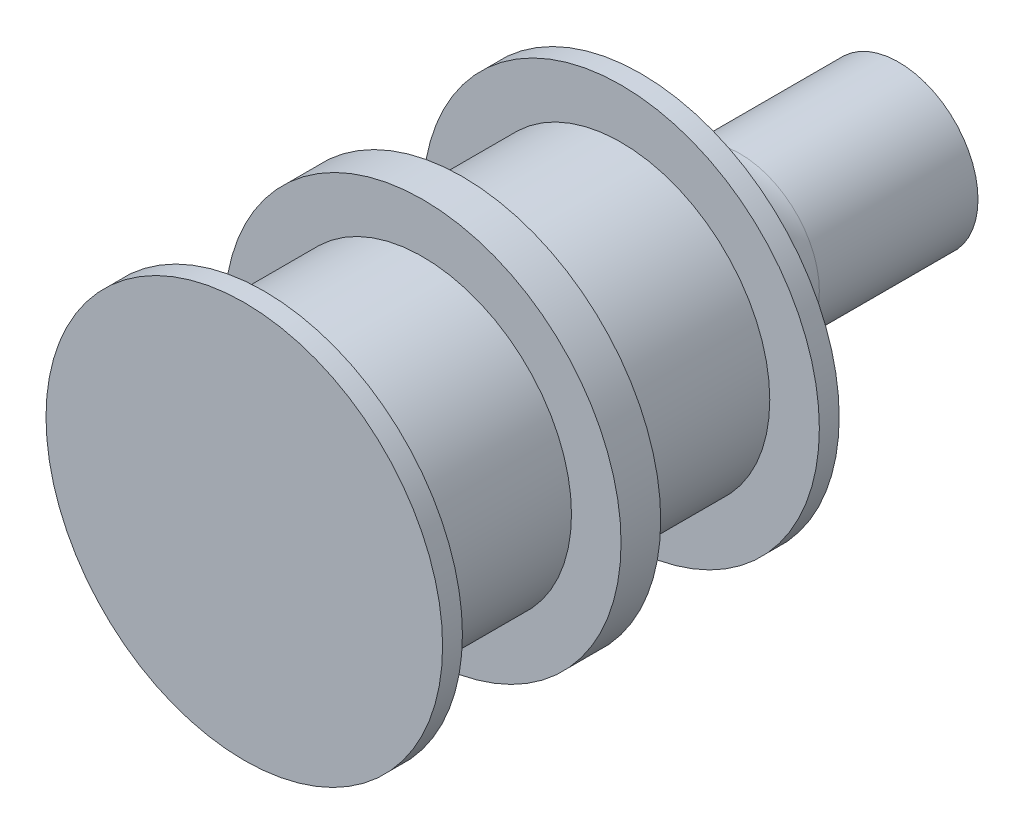
ISO-10303-21;
HEADER;
FILE_DESCRIPTION(('STEP AP214'),'2;1');
FILE_NAME('part.step','',(''),(''),'','','');
FILE_SCHEMA(('AUTOMOTIVE_DESIGN { 1 0 10303 214 1 1 1 1 }'));
ENDSEC;
DATA;
#1=APPLICATION_CONTEXT('core data for automotive mechanical design processes');
#2=APPLICATION_PROTOCOL_DEFINITION('international standard','automotive_design',2000,#1);
#3=PRODUCT_CONTEXT('',#1,'mechanical');
#4=PRODUCT('Part','Part','',(#3));
#5=PRODUCT_RELATED_PRODUCT_CATEGORY('part','',(#4));
#6=PRODUCT_DEFINITION_FORMATION('','',#4);
#7=PRODUCT_DEFINITION_CONTEXT('part definition',#1,'design');
#8=PRODUCT_DEFINITION('design','',#6,#7);
#9=PRODUCT_DEFINITION_SHAPE('','',#8);
#10=(LENGTH_UNIT() NAMED_UNIT(*) SI_UNIT(.MILLI.,.METRE.));
#11=(NAMED_UNIT(*) PLANE_ANGLE_UNIT() SI_UNIT($,.RADIAN.));
#12=(NAMED_UNIT(*) SI_UNIT($,.STERADIAN.) SOLID_ANGLE_UNIT());
#13=UNCERTAINTY_MEASURE_WITH_UNIT(LENGTH_MEASURE(1.E-05),#10,'distance_accuracy_value','');
#14=(GEOMETRIC_REPRESENTATION_CONTEXT(3) GLOBAL_UNCERTAINTY_ASSIGNED_CONTEXT((#13)) GLOBAL_UNIT_ASSIGNED_CONTEXT((#10,
#11,#12)) REPRESENTATION_CONTEXT('',''));
#15=CARTESIAN_POINT('',(0.,0.,0.));
#16=DIRECTION('',(0.,0.,1.));
#17=DIRECTION('',(1.,0.,0.));
#18=AXIS2_PLACEMENT_3D('',#15,#16,#17);
#19=CARTESIAN_POINT('',(0.,0.,5.));
#20=DIRECTION('',(0.,0.,-1.));
#21=DIRECTION('',(-1.,0.,0.));
#22=AXIS2_PLACEMENT_3D('',#19,#20,#21);
#23=CYLINDRICAL_SURFACE('',#22,10.);
#24=CARTESIAN_POINT('',(0.,0.,-5.));
#25=DIRECTION('',(0.,0.,1.));
#26=DIRECTION('',(1.,0.,0.));
#27=AXIS2_PLACEMENT_3D('',#24,#25,#26);
#28=CIRCLE('',#27,10.);
#29=CARTESIAN_POINT('',(10.,0.,-5.));
#30=VERTEX_POINT('',#29);
#31=EDGE_CURVE('E49',#30,#30,#28,.T.);
#32=ORIENTED_EDGE('',*,*,#31,.T.);
#33=EDGE_LOOP('',(#32));
#34=FACE_BOUND('',#33,.T.);
#35=CARTESIAN_POINT('',(0.,0.,-4.));
#36=DIRECTION('',(0.,0.,1.));
#37=DIRECTION('',(1.,0.,0.));
#38=AXIS2_PLACEMENT_3D('',#35,#36,#37);
#39=CIRCLE('',#38,10.);
#40=CARTESIAN_POINT('',(10.,0.,-4.));
#41=VERTEX_POINT('',#40);
#42=EDGE_CURVE('E53',#41,#41,#39,.T.);
#43=ORIENTED_EDGE('',*,*,#42,.F.);
#44=EDGE_LOOP('',(#43));
#45=FACE_BOUND('',#44,.T.);
#46=ADVANCED_FACE('F39',(#34,#45),#23,.T.);
#47=CARTESIAN_POINT('',(0.,0.,-5.));
#48=DIRECTION('',(0.,0.,1.));
#49=DIRECTION('',(1.,0.,0.));
#50=AXIS2_PLACEMENT_3D('',#47,#48,#49);
#51=PLANE('',#50);
#52=CARTESIAN_POINT('',(0.,0.,-5.));
#53=DIRECTION('',(0.,0.,1.));
#54=DIRECTION('',(1.,0.,0.));
#55=AXIS2_PLACEMENT_3D('',#52,#53,#54);
#56=CIRCLE('',#55,9.);
#57=CARTESIAN_POINT('',(9.,0.,-5.));
#58=VERTEX_POINT('',#57);
#59=EDGE_CURVE('E10',#58,#58,#56,.T.);
#60=ORIENTED_EDGE('',*,*,#59,.T.);
#61=EDGE_LOOP('',(#60));
#62=FACE_BOUND('',#61,.T.);
#63=ORIENTED_EDGE('',*,*,#31,.F.);
#64=EDGE_LOOP('',(#63));
#65=FACE_BOUND('',#64,.T.);
#66=ADVANCED_FACE('F119',(#62,#65),#51,.F.);
#67=CARTESIAN_POINT('',(0.,0.,-4.));
#68=DIRECTION('',(0.,0.,1.));
#69=DIRECTION('',(1.,0.,0.));
#70=AXIS2_PLACEMENT_3D('',#67,#68,#69);
#71=PLANE('',#70);
#72=CARTESIAN_POINT('',(0.,0.,-4.));
#73=DIRECTION('',(0.,0.,1.));
#74=DIRECTION('',(1.,0.,0.));
#75=AXIS2_PLACEMENT_3D('',#72,#73,#74);
#76=CIRCLE('',#75,7.5);
#77=CARTESIAN_POINT('',(7.5,0.,-4.));
#78=VERTEX_POINT('',#77);
#79=EDGE_CURVE('E58',#78,#78,#76,.T.);
#80=ORIENTED_EDGE('',*,*,#79,.F.);
#81=EDGE_LOOP('',(#80));
#82=FACE_BOUND('',#81,.T.);
#83=ORIENTED_EDGE('',*,*,#42,.T.);
#84=EDGE_LOOP('',(#83));
#85=FACE_BOUND('',#84,.T.);
#86=ADVANCED_FACE('F130',(#82,#85),#71,.T.);
#87=CARTESIAN_POINT('',(0.,0.,4.));
#88=DIRECTION('',(0.,0.,1.));
#89=DIRECTION('',(1.,0.,0.));
#90=AXIS2_PLACEMENT_3D('',#87,#88,#89);
#91=PLANE('',#90);
#92=CARTESIAN_POINT('',(0.,0.,4.));
#93=DIRECTION('',(0.,0.,1.));
#94=DIRECTION('',(1.,0.,0.));
#95=AXIS2_PLACEMENT_3D('',#92,#93,#94);
#96=CIRCLE('',#95,7.5);
#97=CARTESIAN_POINT('',(7.5,0.,4.));
#98=VERTEX_POINT('',#97);
#99=EDGE_CURVE('E62',#98,#98,#96,.T.);
#100=ORIENTED_EDGE('',*,*,#99,.T.);
#101=EDGE_LOOP('',(#100));
#102=FACE_BOUND('',#101,.T.);
#103=CARTESIAN_POINT('',(0.,0.,4.));
#104=DIRECTION('',(0.,0.,1.));
#105=DIRECTION('',(1.,0.,0.));
#106=AXIS2_PLACEMENT_3D('',#103,#104,#105);
#107=CIRCLE('',#106,10.);
#108=CARTESIAN_POINT('',(10.,0.,4.));
#109=VERTEX_POINT('',#108);
#110=EDGE_CURVE('E60',#109,#109,#107,.T.);
#111=ORIENTED_EDGE('',*,*,#110,.F.);
#112=EDGE_LOOP('',(#111));
#113=FACE_BOUND('',#112,.T.);
#114=ADVANCED_FACE('F142',(#102,#113),#91,.F.);
#115=CARTESIAN_POINT('',(0.,0.,-4.));
#116=DIRECTION('',(0.,0.,1.));
#117=DIRECTION('',(1.,0.,0.));
#118=AXIS2_PLACEMENT_3D('',#115,#116,#117);
#119=CYLINDRICAL_SURFACE('',#118,7.5);
#120=ORIENTED_EDGE('',*,*,#79,.T.);
#121=EDGE_LOOP('',(#120));
#122=FACE_BOUND('',#121,.T.);
#123=ORIENTED_EDGE('',*,*,#99,.F.);
#124=EDGE_LOOP('',(#123));
#125=FACE_BOUND('',#124,.T.);
#126=ADVANCED_FACE('F135',(#122,#125),#119,.T.);
#127=ORIENTED_EDGE('',*,*,#110,.T.);
#128=EDGE_LOOP('',(#127));
#129=FACE_BOUND('',#128,.T.);
#130=CARTESIAN_POINT('',(0.,0.,6.));
#131=DIRECTION('',(0.,0.,1.));
#132=DIRECTION('',(1.,0.,0.));
#133=AXIS2_PLACEMENT_3D('',#130,#131,#132);
#134=CIRCLE('',#133,10.);
#135=CARTESIAN_POINT('',(10.,0.,6.));
#136=VERTEX_POINT('',#135);
#137=EDGE_CURVE('E75',#136,#136,#134,.T.);
#138=ORIENTED_EDGE('',*,*,#137,.F.);
#139=EDGE_LOOP('',(#138));
#140=FACE_BOUND('',#139,.T.);
#141=ADVANCED_FACE('F125',(#129,#140),#23,.T.);
#142=CARTESIAN_POINT('',(0.,0.,5.));
#143=DIRECTION('',(0.,0.,1.));
#144=DIRECTION('',(-1.,0.,0.));
#145=AXIS2_PLACEMENT_3D('',#142,#143,#144);
#146=CYLINDRICAL_SURFACE('',#145,10.);
#147=CARTESIAN_POINT('',(0.,0.,15.));
#148=DIRECTION('',(0.,0.,1.));
#149=DIRECTION('',(1.,0.,0.));
#150=AXIS2_PLACEMENT_3D('',#147,#148,#149);
#151=CIRCLE('',#150,10.);
#152=CARTESIAN_POINT('',(10.,0.,15.));
#153=VERTEX_POINT('',#152);
#154=EDGE_CURVE('E68',#153,#153,#151,.T.);
#155=ORIENTED_EDGE('',*,*,#154,.F.);
#156=EDGE_LOOP('',(#155));
#157=FACE_BOUND('',#156,.T.);
#158=CARTESIAN_POINT('',(0.,0.,14.));
#159=DIRECTION('',(0.,0.,1.));
#160=DIRECTION('',(1.,0.,0.));
#161=AXIS2_PLACEMENT_3D('',#158,#159,#160);
#162=CIRCLE('',#161,10.);
#163=CARTESIAN_POINT('',(10.,0.,14.));
#164=VERTEX_POINT('',#163);
#165=EDGE_CURVE('E72',#164,#164,#162,.T.);
#166=ORIENTED_EDGE('',*,*,#165,.T.);
#167=EDGE_LOOP('',(#166));
#168=FACE_BOUND('',#167,.T.);
#169=ADVANCED_FACE('F131',(#157,#168),#146,.T.);
#170=CARTESIAN_POINT('',(0.,0.,15.));
#171=DIRECTION('',(0.,0.,-1.));
#172=DIRECTION('',(1.,0.,0.));
#173=AXIS2_PLACEMENT_3D('',#170,#171,#172);
#174=PLANE('',#173);
#175=ORIENTED_EDGE('',*,*,#154,.T.);
#176=EDGE_LOOP('',(#175));
#177=FACE_BOUND('',#176,.T.);
#178=ADVANCED_FACE('F136',(#177),#174,.F.);
#179=CARTESIAN_POINT('',(0.,0.,14.));
#180=DIRECTION('',(0.,0.,-1.));
#181=DIRECTION('',(1.,0.,0.));
#182=AXIS2_PLACEMENT_3D('',#179,#180,#181);
#183=PLANE('',#182);
#184=CARTESIAN_POINT('',(0.,0.,14.));
#185=DIRECTION('',(0.,0.,1.));
#186=DIRECTION('',(1.,0.,0.));
#187=AXIS2_PLACEMENT_3D('',#184,#185,#186);
#188=CIRCLE('',#187,7.5);
#189=CARTESIAN_POINT('',(7.5,0.,14.));
#190=VERTEX_POINT('',#189);
#191=EDGE_CURVE('E73',#190,#190,#188,.T.);
#192=ORIENTED_EDGE('',*,*,#191,.T.);
#193=EDGE_LOOP('',(#192));
#194=FACE_BOUND('',#193,.T.);
#195=ORIENTED_EDGE('',*,*,#165,.F.);
#196=EDGE_LOOP('',(#195));
#197=FACE_BOUND('',#196,.T.);
#198=ADVANCED_FACE('F147',(#194,#197),#183,.T.);
#199=CARTESIAN_POINT('',(0.,0.,6.));
#200=DIRECTION('',(0.,0.,-1.));
#201=DIRECTION('',(1.,0.,0.));
#202=AXIS2_PLACEMENT_3D('',#199,#200,#201);
#203=PLANE('',#202);
#204=CARTESIAN_POINT('',(0.,0.,6.));
#205=DIRECTION('',(0.,0.,1.));
#206=DIRECTION('',(1.,0.,0.));
#207=AXIS2_PLACEMENT_3D('',#204,#205,#206);
#208=CIRCLE('',#207,7.5);
#209=CARTESIAN_POINT('',(7.5,0.,6.));
#210=VERTEX_POINT('',#209);
#211=EDGE_CURVE('E77',#210,#210,#208,.T.);
#212=ORIENTED_EDGE('',*,*,#211,.F.);
#213=EDGE_LOOP('',(#212));
#214=FACE_BOUND('',#213,.T.);
#215=ORIENTED_EDGE('',*,*,#137,.T.);
#216=EDGE_LOOP('',(#215));
#217=FACE_BOUND('',#216,.T.);
#218=ADVANCED_FACE('F116',(#214,#217),#203,.F.);
#219=CARTESIAN_POINT('',(0.,0.,14.));
#220=DIRECTION('',(0.,0.,-1.));
#221=DIRECTION('',(1.,0.,0.));
#222=AXIS2_PLACEMENT_3D('',#219,#220,#221);
#223=CYLINDRICAL_SURFACE('',#222,7.5);
#224=ORIENTED_EDGE('',*,*,#191,.F.);
#225=EDGE_LOOP('',(#224));
#226=FACE_BOUND('',#225,.T.);
#227=ORIENTED_EDGE('',*,*,#211,.T.);
#228=EDGE_LOOP('',(#227));
#229=FACE_BOUND('',#228,.T.);
#230=ADVANCED_FACE('F108',(#226,#229),#223,.T.);
#231=CARTESIAN_POINT('',(0.,0.,-18.));
#232=DIRECTION('',(0.,0.,1.));
#233=DIRECTION('',(1.,0.,0.));
#234=AXIS2_PLACEMENT_3D('',#231,#232,#233);
#235=CYLINDRICAL_SURFACE('',#234,4.);
#236=CARTESIAN_POINT('',(0.,0.,-10.));
#237=DIRECTION('',(0.,0.,1.));
#238=DIRECTION('',(1.,0.,0.));
#239=AXIS2_PLACEMENT_3D('',#236,#237,#238);
#240=CIRCLE('',#239,4.);
#241=CARTESIAN_POINT('',(4.,0.,-10.));
#242=VERTEX_POINT('',#241);
#243=EDGE_CURVE('E46',#242,#242,#240,.F.);
#244=CARTESIAN_POINT('',(0.,0.,-18.));
#245=DIRECTION('',(0.,0.,-1.));
#246=DIRECTION('',(-1.,0.,0.));
#247=AXIS2_PLACEMENT_3D('',#244,#245,#246);
#248=CIRCLE('',#247,4.);
#249=CARTESIAN_POINT('',(4.,0.,-18.));
#250=VERTEX_POINT('',#249);
#251=EDGE_CURVE('E83',#250,#250,#248,.T.);
#252=CARTESIAN_POINT('',(4.,0.,-10.));
#253=CARTESIAN_POINT('',(4.,0.,-10.0833333333333));
#254=CARTESIAN_POINT('',(4.,0.,-10.1666666666667));
#255=CARTESIAN_POINT('',(4.,0.,-10.3333333333333));
#256=CARTESIAN_POINT('',(4.,0.,-10.4166666666667));
#257=CARTESIAN_POINT('',(4.,0.,-10.5833333333333));
#258=CARTESIAN_POINT('',(4.,0.,-10.6666666666667));
#259=CARTESIAN_POINT('',(4.,0.,-10.8333333333333));
#260=CARTESIAN_POINT('',(4.,0.,-10.9166666666667));
#261=CARTESIAN_POINT('',(4.,0.,-11.0833333333333));
#262=CARTESIAN_POINT('',(4.,0.,-11.1666666666667));
#263=CARTESIAN_POINT('',(4.,0.,-11.3333333333333));
#264=CARTESIAN_POINT('',(4.,0.,-11.4166666666667));
#265=CARTESIAN_POINT('',(4.,0.,-11.5833333333333));
#266=CARTESIAN_POINT('',(4.,0.,-11.6666666666667));
#267=CARTESIAN_POINT('',(4.,0.,-11.8333333333333));
#268=CARTESIAN_POINT('',(4.,0.,-11.9166666666667));
#269=CARTESIAN_POINT('',(4.,0.,-12.0833333333333));
#270=CARTESIAN_POINT('',(4.,0.,-12.1666666666667));
#271=CARTESIAN_POINT('',(4.,0.,-12.3333333333333));
#272=CARTESIAN_POINT('',(4.,0.,-12.4166666666667));
#273=CARTESIAN_POINT('',(4.,0.,-12.5833333333333));
#274=CARTESIAN_POINT('',(4.,0.,-12.6666666666667));
#275=CARTESIAN_POINT('',(4.,0.,-12.8333333333333));
#276=CARTESIAN_POINT('',(4.,0.,-12.9166666666667));
#277=CARTESIAN_POINT('',(4.,0.,-13.0833333333333));
#278=CARTESIAN_POINT('',(4.,0.,-13.1666666666667));
#279=CARTESIAN_POINT('',(4.,0.,-13.3333333333333));
#280=CARTESIAN_POINT('',(4.,0.,-13.4166666666667));
#281=CARTESIAN_POINT('',(4.,0.,-13.5833333333333));
#282=CARTESIAN_POINT('',(4.,0.,-13.6666666666667));
#283=CARTESIAN_POINT('',(4.,0.,-13.8333333333333));
#284=CARTESIAN_POINT('',(4.,0.,-13.9166666666667));
#285=CARTESIAN_POINT('',(4.,0.,-14.0833333333333));
#286=CARTESIAN_POINT('',(4.,0.,-14.1666666666667));
#287=CARTESIAN_POINT('',(4.,0.,-14.3333333333333));
#288=CARTESIAN_POINT('',(4.,0.,-14.4166666666667));
#289=CARTESIAN_POINT('',(4.,0.,-14.5833333333333));
#290=CARTESIAN_POINT('',(4.,0.,-14.6666666666667));
#291=CARTESIAN_POINT('',(4.,0.,-14.8333333333333));
#292=CARTESIAN_POINT('',(4.,0.,-14.9166666666667));
#293=CARTESIAN_POINT('',(4.,0.,-15.0833333333333));
#294=CARTESIAN_POINT('',(4.,0.,-15.1666666666667));
#295=CARTESIAN_POINT('',(4.,0.,-15.3333333333333));
#296=CARTESIAN_POINT('',(4.,0.,-15.4166666666667));
#297=CARTESIAN_POINT('',(4.,0.,-15.5833333333333));
#298=CARTESIAN_POINT('',(4.,0.,-15.6666666666667));
#299=CARTESIAN_POINT('',(4.,0.,-15.8333333333333));
#300=CARTESIAN_POINT('',(4.,0.,-15.9166666666667));
#301=CARTESIAN_POINT('',(4.,0.,-16.0833333333333));
#302=CARTESIAN_POINT('',(4.,0.,-16.1666666666667));
#303=CARTESIAN_POINT('',(4.,0.,-16.3333333333333));
#304=CARTESIAN_POINT('',(4.,0.,-16.4166666666667));
#305=CARTESIAN_POINT('',(4.,0.,-16.5833333333333));
#306=CARTESIAN_POINT('',(4.,0.,-16.6666666666667));
#307=CARTESIAN_POINT('',(4.,0.,-16.8333333333333));
#308=CARTESIAN_POINT('',(4.,0.,-16.9166666666667));
#309=CARTESIAN_POINT('',(4.,0.,-17.0833333333333));
#310=CARTESIAN_POINT('',(4.,0.,-17.1666666666667));
#311=CARTESIAN_POINT('',(4.,0.,-17.3333333333333));
#312=CARTESIAN_POINT('',(4.,0.,-17.4166666666667));
#313=CARTESIAN_POINT('',(4.,0.,-17.5833333333333));
#314=CARTESIAN_POINT('',(4.,0.,-17.6666666666667));
#315=CARTESIAN_POINT('',(4.,0.,-17.8333333333333));
#316=CARTESIAN_POINT('',(4.,0.,-17.9166666666667));
#317=CARTESIAN_POINT('',(4.,0.,-18.));
#318=B_SPLINE_CURVE_WITH_KNOTS('',3,(#252,#253,#254,#255,#256,#257,#258,#259,#260,#261,#262,
#263,#264,#265,#266,#267,#268,#269,#270,#271,#272,#273,#274,#275,#276,#277,#278,#279,#280,#281,
#282,#283,#284,#285,#286,#287,#288,#289,#290,#291,#292,#293,#294,#295,#296,#297,#298,#299,#300,
#301,#302,#303,#304,#305,#306,#307,#308,#309,#310,#311,#312,#313,#314,#315,#316,#317),
.UNSPECIFIED.,.F.,.F.,(4,2,2,2,2,2,2,2,2,2,2,2,2,2,2,2,2,2,2,2,2,2,2,2,2,2,2,2,2,2,2,2,4),(0.,
0.249999999999999,0.499999999999999,0.749999999999999,0.999999999999999,1.25,1.5,1.75,2.,2.25,
2.5,2.75,3.,3.25,3.5,3.75,4.,4.25,4.5,4.75,5.,5.25,5.49999999999999,5.75,6.,6.24999999999999,
6.49999999999999,6.74999999999999,6.99999999999999,7.24999999999999,7.49999999999999,
7.74999999999999,7.99999999999999),.UNSPECIFIED.);
#319=EDGE_CURVE('BSEAM102',#242,#250,#318,.T.);
#320=ORIENTED_EDGE('',*,*,#243,.T.);
#321=ORIENTED_EDGE('',*,*,#251,.F.);
#322=ORIENTED_EDGE('',*,*,#319,.T.);
#323=ORIENTED_EDGE('',*,*,#319,.F.);
#324=EDGE_LOOP('',(#320,#322,#321,#323));
#325=FACE_BOUND('',#324,.T.);
#326=ADVANCED_FACE('F102',(#325),#235,.T.);
#327=CARTESIAN_POINT('',(0.,0.,-18.));
#328=DIRECTION('',(0.,0.,-1.));
#329=DIRECTION('',(-1.,0.,0.));
#330=AXIS2_PLACEMENT_3D('',#327,#328,#329);
#331=PLANE('',#330);
#332=CARTESIAN_POINT('',(0.,0.,-18.));
#333=DIRECTION('',(0.,0.,-1.));
#334=DIRECTION('',(-1.,0.,0.));
#335=AXIS2_PLACEMENT_3D('',#332,#333,#334);
#336=CIRCLE('',#335,2.5);
#337=CARTESIAN_POINT('',(-2.5,0.,-18.));
#338=VERTEX_POINT('',#337);
#339=EDGE_CURVE('E87',#338,#338,#336,.T.);
#340=ORIENTED_EDGE('',*,*,#339,.F.);
#341=EDGE_LOOP('',(#340));
#342=FACE_BOUND('',#341,.T.);
#343=ORIENTED_EDGE('',*,*,#251,.T.);
#344=EDGE_LOOP('',(#343));
#345=FACE_BOUND('',#344,.T.);
#346=ADVANCED_FACE('F98',(#342,#345),#331,.T.);
#347=CARTESIAN_POINT('',(0.,0.,-10.));
#348=DIRECTION('',(0.,0.,-1.));
#349=DIRECTION('',(-1.,0.,0.));
#350=AXIS2_PLACEMENT_3D('',#347,#348,#349);
#351=CYLINDRICAL_SURFACE('',#350,2.5);
#352=CARTESIAN_POINT('',(0.,0.,-10.));
#353=DIRECTION('',(0.,0.,-1.));
#354=DIRECTION('',(-1.,0.,0.));
#355=AXIS2_PLACEMENT_3D('',#352,#353,#354);
#356=CIRCLE('',#355,2.5);
#357=CARTESIAN_POINT('',(-2.5,0.,-10.));
#358=VERTEX_POINT('',#357);
#359=EDGE_CURVE('E88',#358,#358,#356,.T.);
#360=ORIENTED_EDGE('',*,*,#359,.F.);
#361=EDGE_LOOP('',(#360));
#362=FACE_BOUND('',#361,.T.);
#363=ORIENTED_EDGE('',*,*,#339,.T.);
#364=EDGE_LOOP('',(#363));
#365=FACE_BOUND('',#364,.T.);
#366=ADVANCED_FACE('F92',(#362,#365),#351,.F.);
#367=CARTESIAN_POINT('',(0.,0.,-10.));
#368=DIRECTION('',(0.,0.,-1.));
#369=DIRECTION('',(-1.,0.,0.));
#370=AXIS2_PLACEMENT_3D('',#367,#368,#369);
#371=PLANE('',#370);
#372=ORIENTED_EDGE('',*,*,#359,.T.);
#373=EDGE_LOOP('',(#372));
#374=FACE_BOUND('',#373,.T.);
#375=ADVANCED_FACE('F91',(#374),#371,.T.);
#376=CARTESIAN_POINT('',(0.,0.,-10.));
#377=DIRECTION('',(0.,0.,1.));
#378=DIRECTION('',(1.,0.,0.));
#379=AXIS2_PLACEMENT_3D('',#376,#377,#378);
#380=TOROIDAL_SURFACE('',#379,9.,5.);
#381=ORIENTED_EDGE('',*,*,#59,.F.);
#382=EDGE_LOOP('',(#381));
#383=FACE_BOUND('',#382,.T.);
#384=ORIENTED_EDGE('',*,*,#243,.F.);
#385=EDGE_LOOP('',(#384));
#386=FACE_BOUND('',#385,.T.);
#387=ADVANCED_FACE('F41',(#383,#386),#380,.F.);
#388=CLOSED_SHELL('',(#46,#66,#86,#114,#126,#141,#169,#178,#198,#218,#230,#326,#346,#366,#375,#387));
#389=MANIFOLD_SOLID_BREP('B2',#388);
#390=ADVANCED_BREP_SHAPE_REPRESENTATION('',(#18,#389),#14);
#391=SHAPE_DEFINITION_REPRESENTATION(#9,#390);
ENDSEC;
END-ISO-10303-21;
